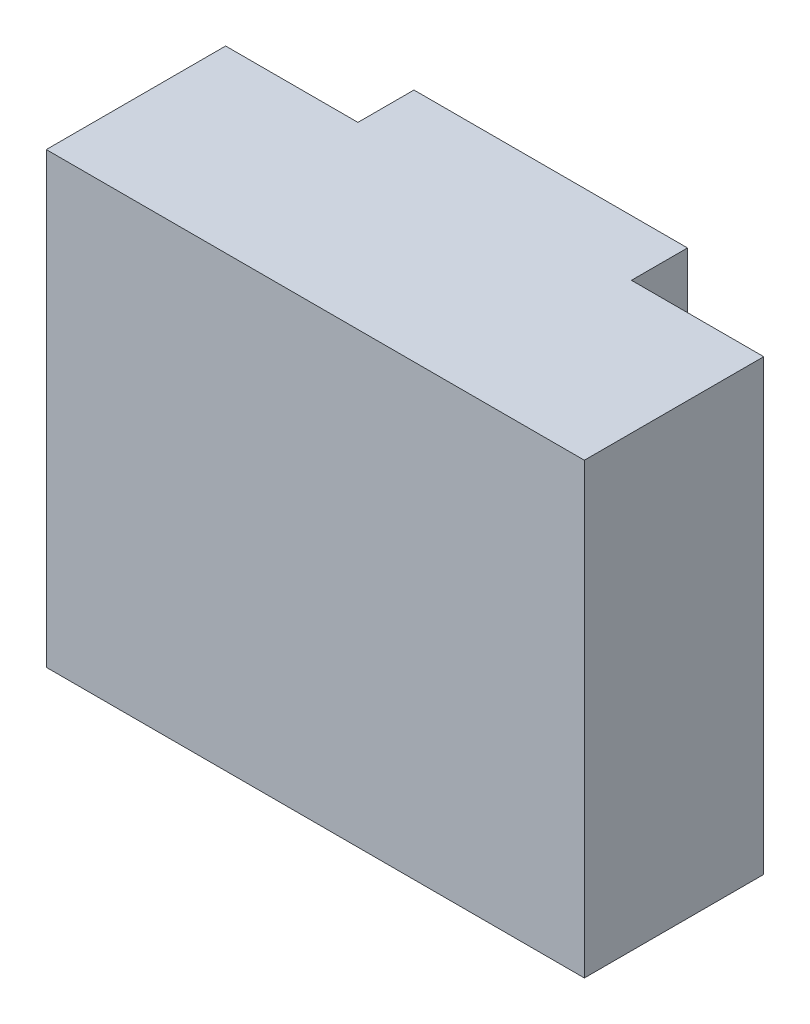
ISO-10303-21;
HEADER;
FILE_DESCRIPTION(('STEP AP214'),'2;1');
FILE_NAME('part.step','',(''),(''),'','','');
FILE_SCHEMA(('AUTOMOTIVE_DESIGN { 1 0 10303 214 1 1 1 1 }'));
ENDSEC;
DATA;
#1=APPLICATION_CONTEXT('core data for automotive mechanical design processes');
#2=APPLICATION_PROTOCOL_DEFINITION('international standard','automotive_design',2000,#1);
#3=PRODUCT_CONTEXT('',#1,'mechanical');
#4=PRODUCT('Part','Part','',(#3));
#5=PRODUCT_RELATED_PRODUCT_CATEGORY('part','',(#4));
#6=PRODUCT_DEFINITION_FORMATION('','',#4);
#7=PRODUCT_DEFINITION_CONTEXT('part definition',#1,'design');
#8=PRODUCT_DEFINITION('design','',#6,#7);
#9=PRODUCT_DEFINITION_SHAPE('','',#8);
#10=(LENGTH_UNIT() NAMED_UNIT(*) SI_UNIT(.MILLI.,.METRE.));
#11=(NAMED_UNIT(*) PLANE_ANGLE_UNIT() SI_UNIT($,.RADIAN.));
#12=(NAMED_UNIT(*) SI_UNIT($,.STERADIAN.) SOLID_ANGLE_UNIT());
#13=UNCERTAINTY_MEASURE_WITH_UNIT(LENGTH_MEASURE(1.E-05),#10,'distance_accuracy_value','');
#14=(GEOMETRIC_REPRESENTATION_CONTEXT(3) GLOBAL_UNCERTAINTY_ASSIGNED_CONTEXT((#13)) GLOBAL_UNIT_ASSIGNED_CONTEXT((#10,
#11,#12)) REPRESENTATION_CONTEXT('',''));
#15=CARTESIAN_POINT('',(0.,0.,0.));
#16=DIRECTION('',(0.,0.,1.));
#17=DIRECTION('',(1.,0.,0.));
#18=AXIS2_PLACEMENT_3D('',#15,#16,#17);
#19=CARTESIAN_POINT('',(6.1,20.,-8.));
#20=DIRECTION('',(-1.,0.,0.));
#21=DIRECTION('',(0.,0.,1.));
#22=AXIS2_PLACEMENT_3D('',#19,#20,#21);
#23=PLANE('',#22);
#24=DIRECTION('',(0.,0.,-1.));
#25=VECTOR('',#24,1.);
#26=CARTESIAN_POINT('',(6.1,0.,-8.));
#27=LINE('',#26,#25);
#28=CARTESIAN_POINT('',(6.1,0.,-8.));
#29=VERTEX_POINT('',#28);
#30=CARTESIAN_POINT('',(6.1,0.,-10.5));
#31=VERTEX_POINT('',#30);
#32=EDGE_CURVE('E131',#29,#31,#27,.T.);
#33=ORIENTED_EDGE('',*,*,#32,.T.);
#34=DIRECTION('',(0.,-1.,0.));
#35=VECTOR('',#34,1.);
#36=CARTESIAN_POINT('',(6.1,20.,-10.5));
#37=LINE('',#36,#35);
#38=CARTESIAN_POINT('',(6.1,20.,-10.5));
#39=VERTEX_POINT('',#38);
#40=EDGE_CURVE('E11',#39,#31,#37,.T.);
#41=ORIENTED_EDGE('',*,*,#40,.F.);
#42=DIRECTION('',(0.,0.,-1.));
#43=VECTOR('',#42,1.);
#44=CARTESIAN_POINT('',(6.1,20.,-8.));
#45=LINE('',#44,#43);
#46=CARTESIAN_POINT('',(6.1,20.,-8.));
#47=VERTEX_POINT('',#46);
#48=EDGE_CURVE('E145',#47,#39,#45,.T.);
#49=ORIENTED_EDGE('',*,*,#48,.F.);
#50=DIRECTION('',(0.,-1.,0.));
#51=VECTOR('',#50,1.);
#52=CARTESIAN_POINT('',(6.1,20.,-8.));
#53=LINE('',#52,#51);
#54=EDGE_CURVE('E127',#47,#29,#53,.T.);
#55=ORIENTED_EDGE('',*,*,#54,.T.);
#56=EDGE_LOOP('',(#33,#41,#49,#55));
#57=FACE_BOUND('',#56,.T.);
#58=ADVANCED_FACE('F35',(#57),#23,.F.);
#59=CARTESIAN_POINT('',(6.1,20.,-10.5));
#60=DIRECTION('',(0.,0.,1.));
#61=DIRECTION('',(1.,0.,0.));
#62=AXIS2_PLACEMENT_3D('',#59,#60,#61);
#63=PLANE('',#62);
#64=DIRECTION('',(-1.,0.,0.));
#65=VECTOR('',#64,1.);
#66=CARTESIAN_POINT('',(6.1,0.,-10.5));
#67=LINE('',#66,#65);
#68=CARTESIAN_POINT('',(-6.1,0.,-10.5));
#69=VERTEX_POINT('',#68);
#70=EDGE_CURVE('E134',#31,#69,#67,.T.);
#71=ORIENTED_EDGE('',*,*,#70,.T.);
#72=DIRECTION('',(0.,-1.,0.));
#73=VECTOR('',#72,1.);
#74=CARTESIAN_POINT('',(-6.1,20.,-10.5));
#75=LINE('',#74,#73);
#76=CARTESIAN_POINT('',(-6.1,20.,-10.5));
#77=VERTEX_POINT('',#76);
#78=EDGE_CURVE('E43',#77,#69,#75,.T.);
#79=ORIENTED_EDGE('',*,*,#78,.F.);
#80=DIRECTION('',(-1.,0.,0.));
#81=VECTOR('',#80,1.);
#82=CARTESIAN_POINT('',(6.1,20.,-10.5));
#83=LINE('',#82,#81);
#84=EDGE_CURVE('E94',#39,#77,#83,.T.);
#85=ORIENTED_EDGE('',*,*,#84,.F.);
#86=ORIENTED_EDGE('',*,*,#40,.T.);
#87=EDGE_LOOP('',(#71,#79,#85,#86));
#88=FACE_BOUND('',#87,.T.);
#89=ADVANCED_FACE('F180',(#88),#63,.F.);
#90=CARTESIAN_POINT('',(-6.1,20.,-8.));
#91=DIRECTION('',(1.,0.,0.));
#92=DIRECTION('',(0.,0.,-1.));
#93=AXIS2_PLACEMENT_3D('',#90,#91,#92);
#94=PLANE('',#93);
#95=DIRECTION('',(0.,0.,1.));
#96=VECTOR('',#95,1.);
#97=CARTESIAN_POINT('',(-6.1,0.,-8.));
#98=LINE('',#97,#96);
#99=CARTESIAN_POINT('',(-6.1,0.,-8.));
#100=VERTEX_POINT('',#99);
#101=EDGE_CURVE('E136',#69,#100,#98,.T.);
#102=ORIENTED_EDGE('',*,*,#101,.T.);
#103=DIRECTION('',(0.,-1.,0.));
#104=VECTOR('',#103,1.);
#105=CARTESIAN_POINT('',(-6.1,20.,-8.));
#106=LINE('',#105,#104);
#107=CARTESIAN_POINT('',(-6.1,20.,-8.));
#108=VERTEX_POINT('',#107);
#109=EDGE_CURVE('E152',#108,#100,#106,.T.);
#110=ORIENTED_EDGE('',*,*,#109,.F.);
#111=DIRECTION('',(0.,0.,1.));
#112=VECTOR('',#111,1.);
#113=CARTESIAN_POINT('',(-6.1,20.,-8.));
#114=LINE('',#113,#112);
#115=EDGE_CURVE('E160',#77,#108,#114,.T.);
#116=ORIENTED_EDGE('',*,*,#115,.F.);
#117=ORIENTED_EDGE('',*,*,#78,.T.);
#118=EDGE_LOOP('',(#102,#110,#116,#117));
#119=FACE_BOUND('',#118,.T.);
#120=ADVANCED_FACE('F158',(#119),#94,.F.);
#121=CARTESIAN_POINT('',(-12.,20.,-8.));
#122=DIRECTION('',(0.,0.,1.));
#123=DIRECTION('',(1.,0.,0.));
#124=AXIS2_PLACEMENT_3D('',#121,#122,#123);
#125=PLANE('',#124);
#126=DIRECTION('',(-1.,0.,0.));
#127=VECTOR('',#126,1.);
#128=CARTESIAN_POINT('',(-12.,0.,-8.));
#129=LINE('',#128,#127);
#130=CARTESIAN_POINT('',(-12.,0.,-8.));
#131=VERTEX_POINT('',#130);
#132=EDGE_CURVE('E138',#100,#131,#129,.T.);
#133=ORIENTED_EDGE('',*,*,#132,.T.);
#134=DIRECTION('',(0.,-1.,0.));
#135=VECTOR('',#134,1.);
#136=CARTESIAN_POINT('',(-12.,20.,-8.));
#137=LINE('',#136,#135);
#138=CARTESIAN_POINT('',(-12.,20.,-8.));
#139=VERTEX_POINT('',#138);
#140=EDGE_CURVE('E149',#139,#131,#137,.T.);
#141=ORIENTED_EDGE('',*,*,#140,.F.);
#142=DIRECTION('',(-1.,0.,0.));
#143=VECTOR('',#142,1.);
#144=CARTESIAN_POINT('',(-12.,20.,-8.));
#145=LINE('',#144,#143);
#146=EDGE_CURVE('E172',#108,#139,#145,.T.);
#147=ORIENTED_EDGE('',*,*,#146,.F.);
#148=ORIENTED_EDGE('',*,*,#109,.T.);
#149=EDGE_LOOP('',(#133,#141,#147,#148));
#150=FACE_BOUND('',#149,.T.);
#151=ADVANCED_FACE('F168',(#150),#125,.F.);
#152=CARTESIAN_POINT('',(-12.,20.,0.));
#153=DIRECTION('',(1.,0.,0.));
#154=DIRECTION('',(0.,0.,-1.));
#155=AXIS2_PLACEMENT_3D('',#152,#153,#154);
#156=PLANE('',#155);
#157=DIRECTION('',(0.,0.,1.));
#158=VECTOR('',#157,1.);
#159=CARTESIAN_POINT('',(-12.,0.,0.));
#160=LINE('',#159,#158);
#161=CARTESIAN_POINT('',(-12.,0.,0.));
#162=VERTEX_POINT('',#161);
#163=EDGE_CURVE('E140',#131,#162,#160,.T.);
#164=ORIENTED_EDGE('',*,*,#163,.T.);
#165=DIRECTION('',(0.,-1.,0.));
#166=VECTOR('',#165,1.);
#167=CARTESIAN_POINT('',(-12.,20.,0.));
#168=LINE('',#167,#166);
#169=CARTESIAN_POINT('',(-12.,20.,0.));
#170=VERTEX_POINT('',#169);
#171=EDGE_CURVE('E122',#170,#162,#168,.T.);
#172=ORIENTED_EDGE('',*,*,#171,.F.);
#173=DIRECTION('',(0.,0.,1.));
#174=VECTOR('',#173,1.);
#175=CARTESIAN_POINT('',(-12.,20.,0.));
#176=LINE('',#175,#174);
#177=EDGE_CURVE('E113',#139,#170,#176,.T.);
#178=ORIENTED_EDGE('',*,*,#177,.F.);
#179=ORIENTED_EDGE('',*,*,#140,.T.);
#180=EDGE_LOOP('',(#164,#172,#178,#179));
#181=FACE_BOUND('',#180,.T.);
#182=ADVANCED_FACE('F171',(#181),#156,.F.);
#183=CARTESIAN_POINT('',(-12.,20.,0.));
#184=DIRECTION('',(0.,0.,-1.));
#185=DIRECTION('',(-1.,0.,0.));
#186=AXIS2_PLACEMENT_3D('',#183,#184,#185);
#187=PLANE('',#186);
#188=DIRECTION('',(1.,0.,0.));
#189=VECTOR('',#188,1.);
#190=CARTESIAN_POINT('',(-12.,0.,0.));
#191=LINE('',#190,#189);
#192=CARTESIAN_POINT('',(12.,0.,0.));
#193=VERTEX_POINT('',#192);
#194=EDGE_CURVE('E121',#162,#193,#191,.T.);
#195=ORIENTED_EDGE('',*,*,#194,.T.);
#196=DIRECTION('',(0.,-1.,0.));
#197=VECTOR('',#196,1.);
#198=CARTESIAN_POINT('',(12.,20.,0.));
#199=LINE('',#198,#197);
#200=CARTESIAN_POINT('',(12.,20.,0.));
#201=VERTEX_POINT('',#200);
#202=EDGE_CURVE('E118',#201,#193,#199,.T.);
#203=ORIENTED_EDGE('',*,*,#202,.F.);
#204=DIRECTION('',(1.,0.,0.));
#205=VECTOR('',#204,1.);
#206=CARTESIAN_POINT('',(-12.,20.,0.));
#207=LINE('',#206,#205);
#208=EDGE_CURVE('E107',#170,#201,#207,.T.);
#209=ORIENTED_EDGE('',*,*,#208,.F.);
#210=ORIENTED_EDGE('',*,*,#171,.T.);
#211=EDGE_LOOP('',(#195,#203,#209,#210));
#212=FACE_BOUND('',#211,.T.);
#213=ADVANCED_FACE('F119',(#212),#187,.F.);
#214=CARTESIAN_POINT('',(12.,20.,0.));
#215=DIRECTION('',(-1.,0.,0.));
#216=DIRECTION('',(0.,0.,1.));
#217=AXIS2_PLACEMENT_3D('',#214,#215,#216);
#218=PLANE('',#217);
#219=DIRECTION('',(0.,0.,-1.));
#220=VECTOR('',#219,1.);
#221=CARTESIAN_POINT('',(12.,0.,0.));
#222=LINE('',#221,#220);
#223=CARTESIAN_POINT('',(12.,0.,-8.));
#224=VERTEX_POINT('',#223);
#225=EDGE_CURVE('E80',#193,#224,#222,.T.);
#226=ORIENTED_EDGE('',*,*,#225,.T.);
#227=DIRECTION('',(0.,-1.,0.));
#228=VECTOR('',#227,1.);
#229=CARTESIAN_POINT('',(12.,20.,-8.));
#230=LINE('',#229,#228);
#231=CARTESIAN_POINT('',(12.,20.,-8.));
#232=VERTEX_POINT('',#231);
#233=EDGE_CURVE('E123',#232,#224,#230,.T.);
#234=ORIENTED_EDGE('',*,*,#233,.F.);
#235=DIRECTION('',(0.,0.,-1.));
#236=VECTOR('',#235,1.);
#237=CARTESIAN_POINT('',(12.,20.,0.));
#238=LINE('',#237,#236);
#239=EDGE_CURVE('E111',#201,#232,#238,.T.);
#240=ORIENTED_EDGE('',*,*,#239,.F.);
#241=ORIENTED_EDGE('',*,*,#202,.T.);
#242=EDGE_LOOP('',(#226,#234,#240,#241));
#243=FACE_BOUND('',#242,.T.);
#244=ADVANCED_FACE('F125',(#243),#218,.F.);
#245=CARTESIAN_POINT('',(12.,20.,-8.));
#246=DIRECTION('',(0.,0.,1.));
#247=DIRECTION('',(1.,0.,0.));
#248=AXIS2_PLACEMENT_3D('',#245,#246,#247);
#249=PLANE('',#248);
#250=DIRECTION('',(-1.,0.,0.));
#251=VECTOR('',#250,1.);
#252=CARTESIAN_POINT('',(12.,0.,-8.));
#253=LINE('',#252,#251);
#254=EDGE_CURVE('E86',#224,#29,#253,.T.);
#255=ORIENTED_EDGE('',*,*,#254,.T.);
#256=ORIENTED_EDGE('',*,*,#54,.F.);
#257=DIRECTION('',(-1.,0.,0.));
#258=VECTOR('',#257,1.);
#259=CARTESIAN_POINT('',(12.,20.,-8.));
#260=LINE('',#259,#258);
#261=EDGE_CURVE('E51',#232,#47,#260,.T.);
#262=ORIENTED_EDGE('',*,*,#261,.F.);
#263=ORIENTED_EDGE('',*,*,#233,.T.);
#264=EDGE_LOOP('',(#255,#256,#262,#263));
#265=FACE_BOUND('',#264,.T.);
#266=ADVANCED_FACE('F196',(#265),#249,.F.);
#267=CARTESIAN_POINT('',(0.,20.,0.));
#268=DIRECTION('',(0.,1.,0.));
#269=DIRECTION('',(0.,0.,1.));
#270=AXIS2_PLACEMENT_3D('',#267,#268,#269);
#271=PLANE('',#270);
#272=ORIENTED_EDGE('',*,*,#48,.T.);
#273=ORIENTED_EDGE('',*,*,#84,.T.);
#274=ORIENTED_EDGE('',*,*,#115,.T.);
#275=ORIENTED_EDGE('',*,*,#146,.T.);
#276=ORIENTED_EDGE('',*,*,#177,.T.);
#277=ORIENTED_EDGE('',*,*,#208,.T.);
#278=ORIENTED_EDGE('',*,*,#239,.T.);
#279=ORIENTED_EDGE('',*,*,#261,.T.);
#280=EDGE_LOOP('',(#272,#273,#274,#275,#276,#277,#278,#279));
#281=FACE_BOUND('',#280,.T.);
#282=ADVANCED_FACE('F109',(#281),#271,.T.);
#283=CARTESIAN_POINT('',(0.,0.,0.));
#284=DIRECTION('',(0.,1.,0.));
#285=DIRECTION('',(0.,0.,1.));
#286=AXIS2_PLACEMENT_3D('',#283,#284,#285);
#287=PLANE('',#286);
#288=ORIENTED_EDGE('',*,*,#32,.F.);
#289=ORIENTED_EDGE('',*,*,#254,.F.);
#290=ORIENTED_EDGE('',*,*,#225,.F.);
#291=ORIENTED_EDGE('',*,*,#194,.F.);
#292=ORIENTED_EDGE('',*,*,#163,.F.);
#293=ORIENTED_EDGE('',*,*,#132,.F.);
#294=ORIENTED_EDGE('',*,*,#101,.F.);
#295=ORIENTED_EDGE('',*,*,#70,.F.);
#296=EDGE_LOOP('',(#288,#289,#290,#291,#292,#293,#294,#295));
#297=FACE_BOUND('',#296,.T.);
#298=ADVANCED_FACE('F164',(#297),#287,.F.);
#299=CLOSED_SHELL('',(#58,#89,#120,#151,#182,#213,#244,#266,#282,#298));
#300=MANIFOLD_SOLID_BREP('B2',#299);
#301=ADVANCED_BREP_SHAPE_REPRESENTATION('',(#18,#300),#14);
#302=SHAPE_DEFINITION_REPRESENTATION(#9,#301);
ENDSEC;
END-ISO-10303-21;
